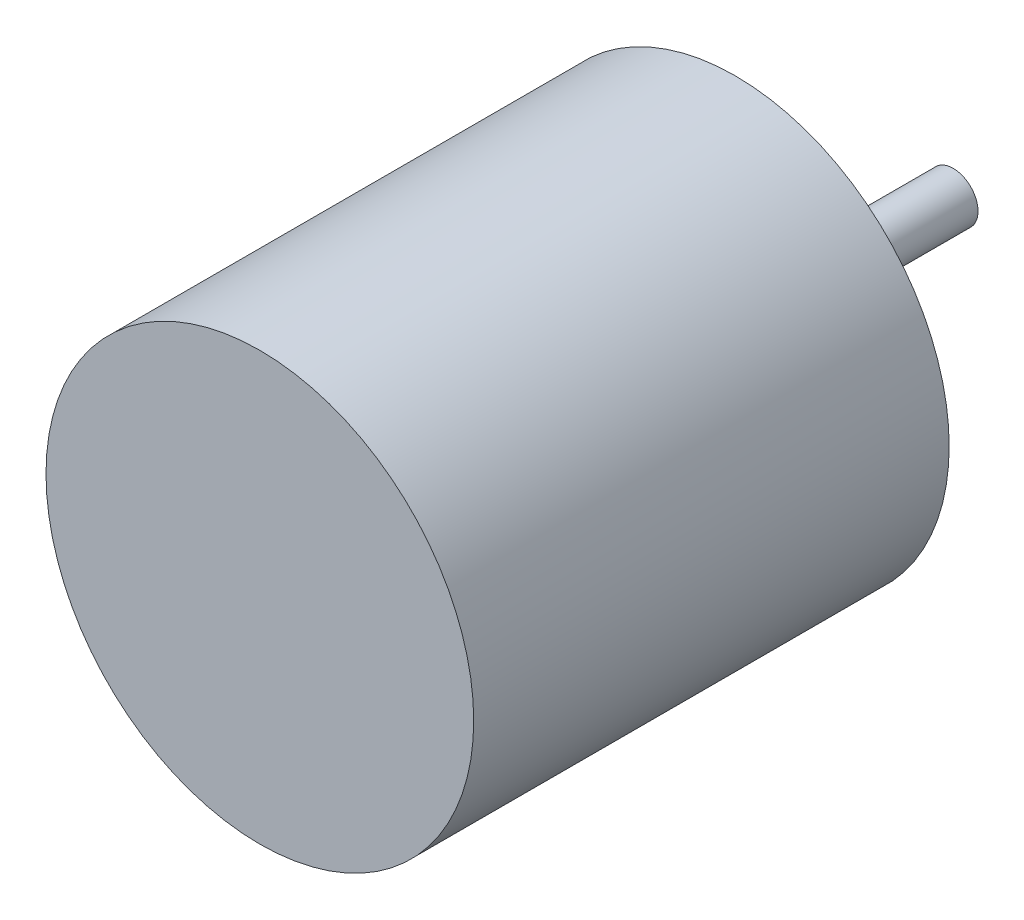
ISO-10303-21;
HEADER;
FILE_DESCRIPTION(('STEP AP214'),'2;1');
FILE_NAME('part.step','',(''),(''),'','','');
FILE_SCHEMA(('AUTOMOTIVE_DESIGN { 1 0 10303 214 1 1 1 1 }'));
ENDSEC;
DATA;
#1=APPLICATION_CONTEXT('core data for automotive mechanical design processes');
#2=APPLICATION_PROTOCOL_DEFINITION('international standard','automotive_design',2000,#1);
#3=PRODUCT_CONTEXT('',#1,'mechanical');
#4=PRODUCT('Part','Part','',(#3));
#5=PRODUCT_RELATED_PRODUCT_CATEGORY('part','',(#4));
#6=PRODUCT_DEFINITION_FORMATION('','',#4);
#7=PRODUCT_DEFINITION_CONTEXT('part definition',#1,'design');
#8=PRODUCT_DEFINITION('design','',#6,#7);
#9=PRODUCT_DEFINITION_SHAPE('','',#8);
#10=(LENGTH_UNIT() NAMED_UNIT(*) SI_UNIT(.MILLI.,.METRE.));
#11=(NAMED_UNIT(*) PLANE_ANGLE_UNIT() SI_UNIT($,.RADIAN.));
#12=(NAMED_UNIT(*) SI_UNIT($,.STERADIAN.) SOLID_ANGLE_UNIT());
#13=UNCERTAINTY_MEASURE_WITH_UNIT(LENGTH_MEASURE(1.E-05),#10,'distance_accuracy_value','');
#14=(GEOMETRIC_REPRESENTATION_CONTEXT(3) GLOBAL_UNCERTAINTY_ASSIGNED_CONTEXT((#13)) GLOBAL_UNIT_ASSIGNED_CONTEXT((#10,
#11,#12)) REPRESENTATION_CONTEXT('',''));
#15=CARTESIAN_POINT('',(0.,0.,0.));
#16=DIRECTION('',(0.,0.,1.));
#17=DIRECTION('',(1.,0.,0.));
#18=AXIS2_PLACEMENT_3D('',#15,#16,#17);
#19=CARTESIAN_POINT('',(0.,0.,48.000000012));
#20=DIRECTION('',(0.,0.,-1.));
#21=DIRECTION('',(-1.,0.,0.));
#22=AXIS2_PLACEMENT_3D('',#19,#20,#21);
#23=CYLINDRICAL_SURFACE('',#22,21.59);
#24=CARTESIAN_POINT('',(0.,0.,48.000000012));
#25=DIRECTION('',(0.,0.,1.));
#26=DIRECTION('',(1.,0.,0.));
#27=AXIS2_PLACEMENT_3D('',#24,#25,#26);
#28=CIRCLE('',#27,21.59);
#29=CARTESIAN_POINT('',(21.59,0.,48.000000012));
#30=VERTEX_POINT('',#29);
#31=EDGE_CURVE('E41',#30,#30,#28,.T.);
#32=ORIENTED_EDGE('',*,*,#31,.F.);
#33=EDGE_LOOP('',(#32));
#34=FACE_BOUND('',#33,.T.);
#35=CARTESIAN_POINT('',(0.,0.,0.));
#36=DIRECTION('',(0.,0.,1.));
#37=DIRECTION('',(1.,0.,0.));
#38=AXIS2_PLACEMENT_3D('',#35,#36,#37);
#39=CIRCLE('',#38,21.59);
#40=CARTESIAN_POINT('',(21.59,0.,0.));
#41=VERTEX_POINT('',#40);
#42=EDGE_CURVE('E45',#41,#41,#39,.T.);
#43=ORIENTED_EDGE('',*,*,#42,.T.);
#44=EDGE_LOOP('',(#43));
#45=FACE_BOUND('',#44,.T.);
#46=ADVANCED_FACE('F35',(#34,#45),#23,.T.);
#47=CARTESIAN_POINT('',(0.,0.,48.000000012));
#48=DIRECTION('',(0.,0.,1.));
#49=DIRECTION('',(1.,0.,0.));
#50=AXIS2_PLACEMENT_3D('',#47,#48,#49);
#51=PLANE('',#50);
#52=ORIENTED_EDGE('',*,*,#31,.T.);
#53=EDGE_LOOP('',(#52));
#54=FACE_BOUND('',#53,.T.);
#55=ADVANCED_FACE('F66',(#54),#51,.T.);
#56=CARTESIAN_POINT('',(0.,0.,0.));
#57=DIRECTION('',(0.,0.,1.));
#58=DIRECTION('',(1.,0.,0.));
#59=AXIS2_PLACEMENT_3D('',#56,#57,#58);
#60=PLANE('',#59);
#61=CARTESIAN_POINT('',(0.,0.,0.));
#62=DIRECTION('',(0.,0.,1.));
#63=DIRECTION('',(1.,0.,0.));
#64=AXIS2_PLACEMENT_3D('',#61,#62,#63);
#65=CIRCLE('',#64,2.499995);
#66=CARTESIAN_POINT('',(2.499995,0.,0.));
#67=VERTEX_POINT('',#66);
#68=EDGE_CURVE('E10',#67,#67,#65,.F.);
#69=ORIENTED_EDGE('',*,*,#68,.F.);
#70=EDGE_LOOP('',(#69));
#71=FACE_BOUND('',#70,.T.);
#72=ORIENTED_EDGE('',*,*,#42,.F.);
#73=EDGE_LOOP('',(#72));
#74=FACE_BOUND('',#73,.T.);
#75=ADVANCED_FACE('F59',(#71,#74),#60,.F.);
#76=CARTESIAN_POINT('',(0.,0.,-21.999999942));
#77=DIRECTION('',(0.,0.,1.));
#78=DIRECTION('',(1.,0.,0.));
#79=AXIS2_PLACEMENT_3D('',#76,#77,#78);
#80=CYLINDRICAL_SURFACE('',#79,2.499995);
#81=CARTESIAN_POINT('',(0.,0.,-21.999999942));
#82=DIRECTION('',(0.,0.,-1.));
#83=DIRECTION('',(-1.,0.,0.));
#84=AXIS2_PLACEMENT_3D('',#81,#82,#83);
#85=CIRCLE('',#84,2.499995);
#86=CARTESIAN_POINT('',(-2.499995,0.,-21.999999942));
#87=VERTEX_POINT('',#86);
#88=EDGE_CURVE('E50',#87,#87,#85,.T.);
#89=ORIENTED_EDGE('',*,*,#88,.F.);
#90=EDGE_LOOP('',(#89));
#91=FACE_BOUND('',#90,.T.);
#92=ORIENTED_EDGE('',*,*,#68,.T.);
#93=EDGE_LOOP('',(#92));
#94=FACE_BOUND('',#93,.T.);
#95=ADVANCED_FACE('F57',(#91,#94),#80,.T.);
#96=CARTESIAN_POINT('',(0.,0.,-21.999999942));
#97=DIRECTION('',(0.,0.,-1.));
#98=DIRECTION('',(-1.,0.,0.));
#99=AXIS2_PLACEMENT_3D('',#96,#97,#98);
#100=PLANE('',#99);
#101=ORIENTED_EDGE('',*,*,#88,.T.);
#102=EDGE_LOOP('',(#101));
#103=FACE_BOUND('',#102,.T.);
#104=ADVANCED_FACE('F55',(#103),#100,.T.);
#105=CLOSED_SHELL('',(#46,#55,#75,#95,#104));
#106=MANIFOLD_SOLID_BREP('B2',#105);
#107=ADVANCED_BREP_SHAPE_REPRESENTATION('',(#18,#106),#14);
#108=SHAPE_DEFINITION_REPRESENTATION(#9,#107);
ENDSEC;
END-ISO-10303-21;
